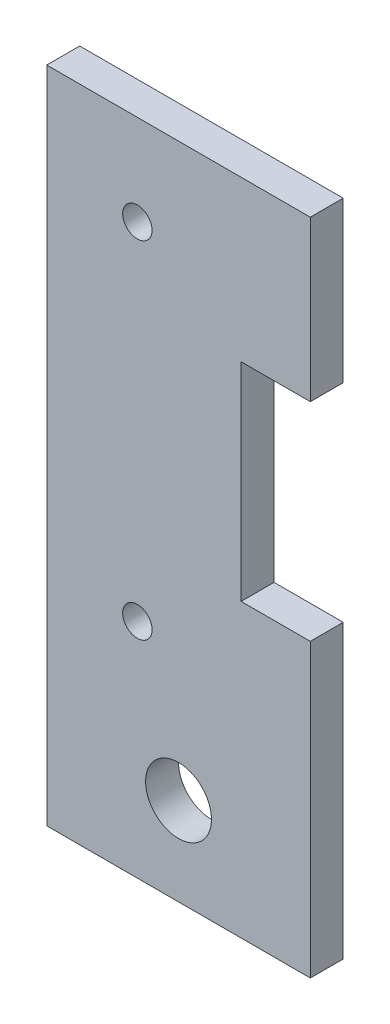
ISO-10303-21;
HEADER;
FILE_DESCRIPTION(('STEP AP214'),'2;1');
FILE_NAME('part.step','',(''),(''),'','','');
FILE_SCHEMA(('AUTOMOTIVE_DESIGN { 1 0 10303 214 1 1 1 1 }'));
ENDSEC;
DATA;
#1=APPLICATION_CONTEXT('core data for automotive mechanical design processes');
#2=APPLICATION_PROTOCOL_DEFINITION('international standard','automotive_design',2000,#1);
#3=PRODUCT_CONTEXT('',#1,'mechanical');
#4=PRODUCT('Part','Part','',(#3));
#5=PRODUCT_RELATED_PRODUCT_CATEGORY('part','',(#4));
#6=PRODUCT_DEFINITION_FORMATION('','',#4);
#7=PRODUCT_DEFINITION_CONTEXT('part definition',#1,'design');
#8=PRODUCT_DEFINITION('design','',#6,#7);
#9=PRODUCT_DEFINITION_SHAPE('','',#8);
#10=(LENGTH_UNIT() NAMED_UNIT(*) SI_UNIT(.MILLI.,.METRE.));
#11=(NAMED_UNIT(*) PLANE_ANGLE_UNIT() SI_UNIT($,.RADIAN.));
#12=(NAMED_UNIT(*) SI_UNIT($,.STERADIAN.) SOLID_ANGLE_UNIT());
#13=UNCERTAINTY_MEASURE_WITH_UNIT(LENGTH_MEASURE(1.E-05),#10,'distance_accuracy_value','');
#14=(GEOMETRIC_REPRESENTATION_CONTEXT(3) GLOBAL_UNCERTAINTY_ASSIGNED_CONTEXT((#13)) GLOBAL_UNIT_ASSIGNED_CONTEXT((#10,
#11,#12)) REPRESENTATION_CONTEXT('',''));
#15=CARTESIAN_POINT('',(0.,0.,0.));
#16=DIRECTION('',(0.,0.,1.));
#17=DIRECTION('',(1.,0.,0.));
#18=AXIS2_PLACEMENT_3D('',#15,#16,#17);
#19=CARTESIAN_POINT('',(0.,38.1,4.7625));
#20=DIRECTION('',(-1.,0.,0.));
#21=DIRECTION('',(0.,-1.,0.));
#22=AXIS2_PLACEMENT_3D('',#19,#20,#21);
#23=PLANE('',#22);
#24=DIRECTION('',(0.,0.,-1.));
#25=VECTOR('',#24,1.);
#26=CARTESIAN_POINT('',(0.,15.,4.7625));
#27=LINE('',#26,#25);
#28=CARTESIAN_POINT('',(0.,15.,4.7625));
#29=VERTEX_POINT('',#28);
#30=CARTESIAN_POINT('',(0.,15.,0.));
#31=VERTEX_POINT('',#30);
#32=EDGE_CURVE('E150',#29,#31,#27,.T.);
#33=ORIENTED_EDGE('',*,*,#32,.T.);
#34=DIRECTION('',(0.,1.,0.));
#35=VECTOR('',#34,1.);
#36=CARTESIAN_POINT('',(0.,38.1,0.));
#37=LINE('',#36,#35);
#38=CARTESIAN_POINT('',(0.,38.1,0.));
#39=VERTEX_POINT('',#38);
#40=EDGE_CURVE('E166',#31,#39,#37,.T.);
#41=ORIENTED_EDGE('',*,*,#40,.T.);
#42=DIRECTION('',(0.,0.,-1.));
#43=VECTOR('',#42,1.);
#44=CARTESIAN_POINT('',(0.,38.1,4.7625));
#45=LINE('',#44,#43);
#46=CARTESIAN_POINT('',(0.,38.1,4.7625));
#47=VERTEX_POINT('',#46);
#48=EDGE_CURVE('E11',#47,#39,#45,.T.);
#49=ORIENTED_EDGE('',*,*,#48,.F.);
#50=DIRECTION('',(0.,1.,0.));
#51=VECTOR('',#50,1.);
#52=CARTESIAN_POINT('',(0.,38.1,4.7625));
#53=LINE('',#52,#51);
#54=EDGE_CURVE('E92',#29,#47,#53,.T.);
#55=ORIENTED_EDGE('',*,*,#54,.F.);
#56=EDGE_LOOP('',(#33,#41,#49,#55));
#57=FACE_BOUND('',#56,.T.);
#58=ADVANCED_FACE('F41',(#57),#23,.F.);
#59=DIRECTION('',(0.,0.,-1.));
#60=VECTOR('',#59,1.);
#61=CARTESIAN_POINT('',(0.,-15.,4.7625));
#62=LINE('',#61,#60);
#63=CARTESIAN_POINT('',(0.,-15.,4.7625));
#64=VERTEX_POINT('',#63);
#65=CARTESIAN_POINT('',(0.,-15.,0.));
#66=VERTEX_POINT('',#65);
#67=EDGE_CURVE('E55',#64,#66,#62,.T.);
#68=ORIENTED_EDGE('',*,*,#67,.F.);
#69=CARTESIAN_POINT('',(0.,-57.15,4.7625));
#70=VERTEX_POINT('',#69);
#71=EDGE_CURVE('E155',#70,#64,#53,.T.);
#72=ORIENTED_EDGE('',*,*,#71,.F.);
#73=DIRECTION('',(0.,0.,-1.));
#74=VECTOR('',#73,1.);
#75=CARTESIAN_POINT('',(0.,-57.15,4.7625));
#76=LINE('',#75,#74);
#77=CARTESIAN_POINT('',(0.,-57.15,0.));
#78=VERTEX_POINT('',#77);
#79=EDGE_CURVE('E162',#70,#78,#76,.T.);
#80=ORIENTED_EDGE('',*,*,#79,.T.);
#81=EDGE_CURVE('E163',#78,#66,#37,.T.);
#82=ORIENTED_EDGE('',*,*,#81,.T.);
#83=EDGE_LOOP('',(#68,#72,#80,#82));
#84=FACE_BOUND('',#83,.T.);
#85=ADVANCED_FACE('F183',(#84),#23,.F.);
#86=CARTESIAN_POINT('',(0.,0.,4.7625));
#87=DIRECTION('',(0.,0.,-1.));
#88=DIRECTION('',(-1.,0.,0.));
#89=AXIS2_PLACEMENT_3D('',#86,#87,#88);
#90=PLANE('',#89);
#91=DIRECTION('',(-1.,0.,0.));
#92=VECTOR('',#91,1.);
#93=CARTESIAN_POINT('',(0.,15.,4.7625));
#94=LINE('',#93,#92);
#95=CARTESIAN_POINT('',(-9.99999999999999,15.,4.7625));
#96=VERTEX_POINT('',#95);
#97=EDGE_CURVE('E132',#29,#96,#94,.T.);
#98=ORIENTED_EDGE('',*,*,#97,.F.);
#99=ORIENTED_EDGE('',*,*,#54,.T.);
#100=DIRECTION('',(-1.,0.,0.));
#101=VECTOR('',#100,1.);
#102=CARTESIAN_POINT('',(0.,38.1,4.7625));
#103=LINE('',#102,#101);
#104=CARTESIAN_POINT('',(-38.1,38.1,4.7625));
#105=VERTEX_POINT('',#104);
#106=EDGE_CURVE('E157',#47,#105,#103,.T.);
#107=ORIENTED_EDGE('',*,*,#106,.T.);
#108=DIRECTION('',(0.,-1.,0.));
#109=VECTOR('',#108,1.);
#110=CARTESIAN_POINT('',(-38.1,38.1,4.7625));
#111=LINE('',#110,#109);
#112=CARTESIAN_POINT('',(-38.1,-57.15,4.7625));
#113=VERTEX_POINT('',#112);
#114=EDGE_CURVE('E159',#105,#113,#111,.T.);
#115=ORIENTED_EDGE('',*,*,#114,.T.);
#116=DIRECTION('',(1.,0.,0.));
#117=VECTOR('',#116,1.);
#118=CARTESIAN_POINT('',(0.,-57.15,4.7625));
#119=LINE('',#118,#117);
#120=EDGE_CURVE('E64',#113,#70,#119,.T.);
#121=ORIENTED_EDGE('',*,*,#120,.T.);
#122=ORIENTED_EDGE('',*,*,#71,.T.);
#123=DIRECTION('',(1.,0.,0.));
#124=VECTOR('',#123,1.);
#125=CARTESIAN_POINT('',(0.,-15.,4.7625));
#126=LINE('',#125,#124);
#127=CARTESIAN_POINT('',(-9.99999999999999,-15.,4.7625));
#128=VERTEX_POINT('',#127);
#129=EDGE_CURVE('E143',#128,#64,#126,.T.);
#130=ORIENTED_EDGE('',*,*,#129,.F.);
#131=DIRECTION('',(0.,-1.,0.));
#132=VECTOR('',#131,1.);
#133=CARTESIAN_POINT('',(-9.99999999999999,15.,4.7625));
#134=LINE('',#133,#132);
#135=EDGE_CURVE('E123',#96,#128,#134,.T.);
#136=ORIENTED_EDGE('',*,*,#135,.F.);
#137=EDGE_LOOP('',(#98,#99,#107,#115,#121,#122,#130,#136));
#138=FACE_BOUND('',#137,.T.);
#139=CARTESIAN_POINT('',(-25.,25.,4.7625));
#140=DIRECTION('',(0.,0.,1.));
#141=DIRECTION('',(1.,0.,0.));
#142=AXIS2_PLACEMENT_3D('',#139,#140,#141);
#143=CIRCLE('',#142,2.125);
#144=CARTESIAN_POINT('',(-27.125,25.,4.7625));
#145=VERTEX_POINT('',#144);
#146=EDGE_CURVE('E151',#145,#145,#143,.T.);
#147=ORIENTED_EDGE('',*,*,#146,.F.);
#148=EDGE_LOOP('',(#147));
#149=FACE_BOUND('',#148,.T.);
#150=CARTESIAN_POINT('',(-25.,-25.,4.7625));
#151=DIRECTION('',(0.,0.,1.));
#152=DIRECTION('',(1.,0.,0.));
#153=AXIS2_PLACEMENT_3D('',#150,#151,#152);
#154=CIRCLE('',#153,2.125);
#155=CARTESIAN_POINT('',(-27.125,-25.,4.7625));
#156=VERTEX_POINT('',#155);
#157=EDGE_CURVE('E217',#156,#156,#154,.T.);
#158=ORIENTED_EDGE('',*,*,#157,.F.);
#159=EDGE_LOOP('',(#158));
#160=FACE_BOUND('',#159,.T.);
#161=CARTESIAN_POINT('',(-19.05,-44.45,4.7625));
#162=DIRECTION('',(0.,0.,1.));
#163=DIRECTION('',(1.,0.,0.));
#164=AXIS2_PLACEMENT_3D('',#161,#162,#163);
#165=CIRCLE('',#164,4.7625);
#166=CARTESIAN_POINT('',(-23.8125,-44.45,4.7625));
#167=VERTEX_POINT('',#166);
#168=EDGE_CURVE('E207',#167,#167,#165,.T.);
#169=ORIENTED_EDGE('',*,*,#168,.F.);
#170=EDGE_LOOP('',(#169));
#171=FACE_BOUND('',#170,.T.);
#172=ADVANCED_FACE('F203',(#138,#149,#160,#171),#90,.F.);
#173=CARTESIAN_POINT('',(0.,0.,0.));
#174=DIRECTION('',(0.,0.,-1.));
#175=DIRECTION('',(-1.,0.,0.));
#176=AXIS2_PLACEMENT_3D('',#173,#174,#175);
#177=PLANE('',#176);
#178=CARTESIAN_POINT('',(-25.,-25.,0.));
#179=DIRECTION('',(0.,0.,1.));
#180=DIRECTION('',(1.,0.,0.));
#181=AXIS2_PLACEMENT_3D('',#178,#179,#180);
#182=CIRCLE('',#181,2.125);
#183=CARTESIAN_POINT('',(-27.125,-25.,0.));
#184=VERTEX_POINT('',#183);
#185=EDGE_CURVE('E154',#184,#184,#182,.T.);
#186=ORIENTED_EDGE('',*,*,#185,.T.);
#187=EDGE_LOOP('',(#186));
#188=FACE_BOUND('',#187,.T.);
#189=ORIENTED_EDGE('',*,*,#40,.F.);
#190=DIRECTION('',(-1.,0.,0.));
#191=VECTOR('',#190,1.);
#192=CARTESIAN_POINT('',(0.,15.,0.));
#193=LINE('',#192,#191);
#194=CARTESIAN_POINT('',(-9.99999999999999,15.,0.));
#195=VERTEX_POINT('',#194);
#196=EDGE_CURVE('E137',#31,#195,#193,.T.);
#197=ORIENTED_EDGE('',*,*,#196,.T.);
#198=DIRECTION('',(0.,-1.,0.));
#199=VECTOR('',#198,1.);
#200=CARTESIAN_POINT('',(-9.99999999999999,15.,0.));
#201=LINE('',#200,#199);
#202=CARTESIAN_POINT('',(-9.99999999999999,-15.,0.));
#203=VERTEX_POINT('',#202);
#204=EDGE_CURVE('E120',#195,#203,#201,.T.);
#205=ORIENTED_EDGE('',*,*,#204,.T.);
#206=DIRECTION('',(1.,0.,0.));
#207=VECTOR('',#206,1.);
#208=CARTESIAN_POINT('',(0.,-15.,0.));
#209=LINE('',#208,#207);
#210=EDGE_CURVE('E127',#203,#66,#209,.T.);
#211=ORIENTED_EDGE('',*,*,#210,.T.);
#212=ORIENTED_EDGE('',*,*,#81,.F.);
#213=DIRECTION('',(1.,0.,0.));
#214=VECTOR('',#213,1.);
#215=CARTESIAN_POINT('',(0.,-57.15,0.));
#216=LINE('',#215,#214);
#217=CARTESIAN_POINT('',(-38.1,-57.15,0.));
#218=VERTEX_POINT('',#217);
#219=EDGE_CURVE('E85',#218,#78,#216,.T.);
#220=ORIENTED_EDGE('',*,*,#219,.F.);
#221=DIRECTION('',(0.,-1.,0.));
#222=VECTOR('',#221,1.);
#223=CARTESIAN_POINT('',(-38.1,38.1,0.));
#224=LINE('',#223,#222);
#225=CARTESIAN_POINT('',(-38.1,38.1,0.));
#226=VERTEX_POINT('',#225);
#227=EDGE_CURVE('E168',#226,#218,#224,.T.);
#228=ORIENTED_EDGE('',*,*,#227,.F.);
#229=DIRECTION('',(-1.,0.,0.));
#230=VECTOR('',#229,1.);
#231=CARTESIAN_POINT('',(0.,38.1,0.));
#232=LINE('',#231,#230);
#233=EDGE_CURVE('E165',#39,#226,#232,.T.);
#234=ORIENTED_EDGE('',*,*,#233,.F.);
#235=EDGE_LOOP('',(#189,#197,#205,#211,#212,#220,#228,#234));
#236=FACE_BOUND('',#235,.T.);
#237=CARTESIAN_POINT('',(-25.,25.,0.));
#238=DIRECTION('',(0.,0.,1.));
#239=DIRECTION('',(1.,0.,0.));
#240=AXIS2_PLACEMENT_3D('',#237,#238,#239);
#241=CIRCLE('',#240,2.125);
#242=CARTESIAN_POINT('',(-27.125,25.,0.));
#243=VERTEX_POINT('',#242);
#244=EDGE_CURVE('E147',#243,#243,#241,.T.);
#245=ORIENTED_EDGE('',*,*,#244,.T.);
#246=EDGE_LOOP('',(#245));
#247=FACE_BOUND('',#246,.T.);
#248=CARTESIAN_POINT('',(-19.05,-44.45,0.));
#249=DIRECTION('',(0.,0.,1.));
#250=DIRECTION('',(1.,0.,0.));
#251=AXIS2_PLACEMENT_3D('',#248,#249,#250);
#252=CIRCLE('',#251,4.7625);
#253=CARTESIAN_POINT('',(-23.8125,-44.45,0.));
#254=VERTEX_POINT('',#253);
#255=EDGE_CURVE('E139',#254,#254,#252,.T.);
#256=ORIENTED_EDGE('',*,*,#255,.T.);
#257=EDGE_LOOP('',(#256));
#258=FACE_BOUND('',#257,.T.);
#259=ADVANCED_FACE('F135',(#188,#236,#247,#258),#177,.T.);
#260=CARTESIAN_POINT('',(0.,38.1,4.7625));
#261=DIRECTION('',(0.,-1.,0.));
#262=DIRECTION('',(1.,0.,0.));
#263=AXIS2_PLACEMENT_3D('',#260,#261,#262);
#264=PLANE('',#263);
#265=ORIENTED_EDGE('',*,*,#233,.T.);
#266=DIRECTION('',(0.,0.,-1.));
#267=VECTOR('',#266,1.);
#268=CARTESIAN_POINT('',(-38.1,38.1,4.7625));
#269=LINE('',#268,#267);
#270=EDGE_CURVE('E48',#105,#226,#269,.T.);
#271=ORIENTED_EDGE('',*,*,#270,.F.);
#272=ORIENTED_EDGE('',*,*,#106,.F.);
#273=ORIENTED_EDGE('',*,*,#48,.T.);
#274=EDGE_LOOP('',(#265,#271,#272,#273));
#275=FACE_BOUND('',#274,.T.);
#276=ADVANCED_FACE('F195',(#275),#264,.F.);
#277=CARTESIAN_POINT('',(-38.1,38.1,4.7625));
#278=DIRECTION('',(1.,0.,0.));
#279=DIRECTION('',(0.,1.,0.));
#280=AXIS2_PLACEMENT_3D('',#277,#278,#279);
#281=PLANE('',#280);
#282=ORIENTED_EDGE('',*,*,#227,.T.);
#283=DIRECTION('',(0.,0.,-1.));
#284=VECTOR('',#283,1.);
#285=CARTESIAN_POINT('',(-38.1,-57.15,4.7625));
#286=LINE('',#285,#284);
#287=EDGE_CURVE('E172',#113,#218,#286,.T.);
#288=ORIENTED_EDGE('',*,*,#287,.F.);
#289=ORIENTED_EDGE('',*,*,#114,.F.);
#290=ORIENTED_EDGE('',*,*,#270,.T.);
#291=EDGE_LOOP('',(#282,#288,#289,#290));
#292=FACE_BOUND('',#291,.T.);
#293=ADVANCED_FACE('F178',(#292),#281,.F.);
#294=CARTESIAN_POINT('',(0.,-57.15,4.7625));
#295=DIRECTION('',(0.,1.,0.));
#296=DIRECTION('',(-1.,0.,0.));
#297=AXIS2_PLACEMENT_3D('',#294,#295,#296);
#298=PLANE('',#297);
#299=ORIENTED_EDGE('',*,*,#219,.T.);
#300=ORIENTED_EDGE('',*,*,#79,.F.);
#301=ORIENTED_EDGE('',*,*,#120,.F.);
#302=ORIENTED_EDGE('',*,*,#287,.T.);
#303=EDGE_LOOP('',(#299,#300,#301,#302));
#304=FACE_BOUND('',#303,.T.);
#305=ADVANCED_FACE('F185',(#304),#298,.F.);
#306=CARTESIAN_POINT('',(0.,15.,4.7625));
#307=DIRECTION('',(0.,-1.,0.));
#308=DIRECTION('',(1.,0.,0.));
#309=AXIS2_PLACEMENT_3D('',#306,#307,#308);
#310=PLANE('',#309);
#311=ORIENTED_EDGE('',*,*,#196,.F.);
#312=ORIENTED_EDGE('',*,*,#32,.F.);
#313=ORIENTED_EDGE('',*,*,#97,.T.);
#314=DIRECTION('',(0.,0.,-1.));
#315=VECTOR('',#314,1.);
#316=CARTESIAN_POINT('',(-9.99999999999999,15.,4.7625));
#317=LINE('',#316,#315);
#318=EDGE_CURVE('E125',#96,#195,#317,.T.);
#319=ORIENTED_EDGE('',*,*,#318,.T.);
#320=EDGE_LOOP('',(#311,#312,#313,#319));
#321=FACE_BOUND('',#320,.T.);
#322=ADVANCED_FACE('F187',(#321),#310,.T.);
#323=CARTESIAN_POINT('',(-9.99999999999999,15.,4.7625));
#324=DIRECTION('',(1.,0.,0.));
#325=DIRECTION('',(0.,0.,-1.));
#326=AXIS2_PLACEMENT_3D('',#323,#324,#325);
#327=PLANE('',#326);
#328=ORIENTED_EDGE('',*,*,#204,.F.);
#329=ORIENTED_EDGE('',*,*,#318,.F.);
#330=ORIENTED_EDGE('',*,*,#135,.T.);
#331=DIRECTION('',(0.,0.,-1.));
#332=VECTOR('',#331,1.);
#333=CARTESIAN_POINT('',(-9.99999999999999,-15.,4.7625));
#334=LINE('',#333,#332);
#335=EDGE_CURVE('E116',#128,#203,#334,.T.);
#336=ORIENTED_EDGE('',*,*,#335,.T.);
#337=EDGE_LOOP('',(#328,#329,#330,#336));
#338=FACE_BOUND('',#337,.T.);
#339=ADVANCED_FACE('F117',(#338),#327,.T.);
#340=CARTESIAN_POINT('',(0.,-15.,4.7625));
#341=DIRECTION('',(0.,1.,0.));
#342=DIRECTION('',(-1.,0.,0.));
#343=AXIS2_PLACEMENT_3D('',#340,#341,#342);
#344=PLANE('',#343);
#345=ORIENTED_EDGE('',*,*,#210,.F.);
#346=ORIENTED_EDGE('',*,*,#335,.F.);
#347=ORIENTED_EDGE('',*,*,#129,.T.);
#348=ORIENTED_EDGE('',*,*,#67,.T.);
#349=EDGE_LOOP('',(#345,#346,#347,#348));
#350=FACE_BOUND('',#349,.T.);
#351=ADVANCED_FACE('F128',(#350),#344,.T.);
#352=CARTESIAN_POINT('',(-25.,25.,4.7625));
#353=DIRECTION('',(0.,0.,-1.));
#354=DIRECTION('',(-1.,0.,0.));
#355=AXIS2_PLACEMENT_3D('',#352,#353,#354);
#356=CYLINDRICAL_SURFACE('',#355,2.125);
#357=CARTESIAN_POINT('',(-27.125,25.,4.7625));
#358=CARTESIAN_POINT('',(-27.125,25.,4.712890625));
#359=CARTESIAN_POINT('',(-27.125,25.,4.66328125));
#360=CARTESIAN_POINT('',(-27.125,25.,4.5640625));
#361=CARTESIAN_POINT('',(-27.125,25.,4.514453125));
#362=CARTESIAN_POINT('',(-27.125,25.,4.415234375));
#363=CARTESIAN_POINT('',(-27.125,25.,4.365625));
#364=CARTESIAN_POINT('',(-27.125,25.,4.26640625));
#365=CARTESIAN_POINT('',(-27.125,25.,4.216796875));
#366=CARTESIAN_POINT('',(-27.125,25.,4.117578125));
#367=CARTESIAN_POINT('',(-27.125,25.,4.06796875));
#368=CARTESIAN_POINT('',(-27.125,25.,3.96875));
#369=CARTESIAN_POINT('',(-27.125,25.,3.919140625));
#370=CARTESIAN_POINT('',(-27.125,25.,3.819921875));
#371=CARTESIAN_POINT('',(-27.125,25.,3.7703125));
#372=CARTESIAN_POINT('',(-27.125,25.,3.67109375));
#373=CARTESIAN_POINT('',(-27.125,25.,3.621484375));
#374=CARTESIAN_POINT('',(-27.125,25.,3.522265625));
#375=CARTESIAN_POINT('',(-27.125,25.,3.47265625));
#376=CARTESIAN_POINT('',(-27.125,25.,3.3734375));
#377=CARTESIAN_POINT('',(-27.125,25.,3.323828125));
#378=CARTESIAN_POINT('',(-27.125,25.,3.224609375));
#379=CARTESIAN_POINT('',(-27.125,25.,3.175));
#380=CARTESIAN_POINT('',(-27.125,25.,3.07578125));
#381=CARTESIAN_POINT('',(-27.125,25.,3.026171875));
#382=CARTESIAN_POINT('',(-27.125,25.,2.926953125));
#383=CARTESIAN_POINT('',(-27.125,25.,2.87734375));
#384=CARTESIAN_POINT('',(-27.125,25.,2.778125));
#385=CARTESIAN_POINT('',(-27.125,25.,2.728515625));
#386=CARTESIAN_POINT('',(-27.125,25.,2.629296875));
#387=CARTESIAN_POINT('',(-27.125,25.,2.5796875));
#388=CARTESIAN_POINT('',(-27.125,25.,2.48046875));
#389=CARTESIAN_POINT('',(-27.125,25.,2.430859375));
#390=CARTESIAN_POINT('',(-27.125,25.,2.331640625));
#391=CARTESIAN_POINT('',(-27.125,25.,2.28203125));
#392=CARTESIAN_POINT('',(-27.125,25.,2.1828125));
#393=CARTESIAN_POINT('',(-27.125,25.,2.133203125));
#394=CARTESIAN_POINT('',(-27.125,25.,2.033984375));
#395=CARTESIAN_POINT('',(-27.125,25.,1.984375));
#396=CARTESIAN_POINT('',(-27.125,25.,1.88515625));
#397=CARTESIAN_POINT('',(-27.125,25.,1.835546875));
#398=CARTESIAN_POINT('',(-27.125,25.,1.736328125));
#399=CARTESIAN_POINT('',(-27.125,25.,1.68671875));
#400=CARTESIAN_POINT('',(-27.125,25.,1.5875));
#401=CARTESIAN_POINT('',(-27.125,25.,1.537890625));
#402=CARTESIAN_POINT('',(-27.125,25.,1.438671875));
#403=CARTESIAN_POINT('',(-27.125,25.,1.3890625));
#404=CARTESIAN_POINT('',(-27.125,25.,1.28984375));
#405=CARTESIAN_POINT('',(-27.125,25.,1.240234375));
#406=CARTESIAN_POINT('',(-27.125,25.,1.141015625));
#407=CARTESIAN_POINT('',(-27.125,25.,1.09140625));
#408=CARTESIAN_POINT('',(-27.125,25.,0.9921875));
#409=CARTESIAN_POINT('',(-27.125,25.,0.942578125));
#410=CARTESIAN_POINT('',(-27.125,25.,0.843359375));
#411=CARTESIAN_POINT('',(-27.125,25.,0.79375));
#412=CARTESIAN_POINT('',(-27.125,25.,0.69453125));
#413=CARTESIAN_POINT('',(-27.125,25.,0.644921875));
#414=CARTESIAN_POINT('',(-27.125,25.,0.545703125));
#415=CARTESIAN_POINT('',(-27.125,25.,0.49609375));
#416=CARTESIAN_POINT('',(-27.125,25.,0.396875));
#417=CARTESIAN_POINT('',(-27.125,25.,0.347265625));
#418=CARTESIAN_POINT('',(-27.125,25.,0.248046875));
#419=CARTESIAN_POINT('',(-27.125,25.,0.1984375));
#420=CARTESIAN_POINT('',(-27.125,25.,0.09921875));
#421=CARTESIAN_POINT('',(-27.125,25.,0.049609375));
#422=CARTESIAN_POINT('',(-27.125,25.,0.));
#423=B_SPLINE_CURVE_WITH_KNOTS('',3,(#357,#358,#359,#360,#361,#362,#363,#364,#365,#366,#367,
#368,#369,#370,#371,#372,#373,#374,#375,#376,#377,#378,#379,#380,#381,#382,#383,#384,#385,#386,
#387,#388,#389,#390,#391,#392,#393,#394,#395,#396,#397,#398,#399,#400,#401,#402,#403,#404,#405,
#406,#407,#408,#409,#410,#411,#412,#413,#414,#415,#416,#417,#418,#419,#420,#421,#422),
.UNSPECIFIED.,.F.,.F.,(4,2,2,2,2,2,2,2,2,2,2,2,2,2,2,2,2,2,2,2,2,2,2,2,2,2,2,2,2,2,2,2,4),(0.,
0.148828124999999,0.297656249999999,0.446484374999999,0.595312499999999,0.744140625,0.89296875,
1.041796875,1.190625,1.339453125,1.48828125,1.637109375,1.7859375,1.934765625,2.08359375,
2.232421875,2.38125,2.530078125,2.67890625,2.827734375,2.9765625,3.125390625,3.27421875,
3.423046875,3.571875,3.720703125,3.86953125,4.018359375,4.1671875,4.316015625,4.46484375,
4.613671875,4.7625),.UNSPECIFIED.);
#424=EDGE_CURVE('BSEAM232',#145,#243,#423,.T.);
#425=ORIENTED_EDGE('',*,*,#146,.T.);
#426=ORIENTED_EDGE('',*,*,#244,.F.);
#427=ORIENTED_EDGE('',*,*,#424,.T.);
#428=ORIENTED_EDGE('',*,*,#424,.F.);
#429=EDGE_LOOP('',(#425,#427,#426,#428));
#430=FACE_BOUND('',#429,.T.);
#431=ADVANCED_FACE('F232',(#430),#356,.F.);
#432=CARTESIAN_POINT('',(-25.,-25.,4.7625));
#433=DIRECTION('',(0.,0.,-1.));
#434=DIRECTION('',(-1.,0.,0.));
#435=AXIS2_PLACEMENT_3D('',#432,#433,#434);
#436=CYLINDRICAL_SURFACE('',#435,2.125);
#437=CARTESIAN_POINT('',(-27.125,-25.,4.7625));
#438=CARTESIAN_POINT('',(-27.125,-25.,4.712890625));
#439=CARTESIAN_POINT('',(-27.125,-25.,4.66328125));
#440=CARTESIAN_POINT('',(-27.125,-25.,4.5640625));
#441=CARTESIAN_POINT('',(-27.125,-25.,4.514453125));
#442=CARTESIAN_POINT('',(-27.125,-25.,4.415234375));
#443=CARTESIAN_POINT('',(-27.125,-25.,4.365625));
#444=CARTESIAN_POINT('',(-27.125,-25.,4.26640625));
#445=CARTESIAN_POINT('',(-27.125,-25.,4.216796875));
#446=CARTESIAN_POINT('',(-27.125,-25.,4.117578125));
#447=CARTESIAN_POINT('',(-27.125,-25.,4.06796875));
#448=CARTESIAN_POINT('',(-27.125,-25.,3.96875));
#449=CARTESIAN_POINT('',(-27.125,-25.,3.919140625));
#450=CARTESIAN_POINT('',(-27.125,-25.,3.819921875));
#451=CARTESIAN_POINT('',(-27.125,-25.,3.7703125));
#452=CARTESIAN_POINT('',(-27.125,-25.,3.67109375));
#453=CARTESIAN_POINT('',(-27.125,-25.,3.621484375));
#454=CARTESIAN_POINT('',(-27.125,-25.,3.522265625));
#455=CARTESIAN_POINT('',(-27.125,-25.,3.47265625));
#456=CARTESIAN_POINT('',(-27.125,-25.,3.3734375));
#457=CARTESIAN_POINT('',(-27.125,-25.,3.323828125));
#458=CARTESIAN_POINT('',(-27.125,-25.,3.224609375));
#459=CARTESIAN_POINT('',(-27.125,-25.,3.175));
#460=CARTESIAN_POINT('',(-27.125,-25.,3.07578125));
#461=CARTESIAN_POINT('',(-27.125,-25.,3.026171875));
#462=CARTESIAN_POINT('',(-27.125,-25.,2.926953125));
#463=CARTESIAN_POINT('',(-27.125,-25.,2.87734375));
#464=CARTESIAN_POINT('',(-27.125,-25.,2.778125));
#465=CARTESIAN_POINT('',(-27.125,-25.,2.728515625));
#466=CARTESIAN_POINT('',(-27.125,-25.,2.629296875));
#467=CARTESIAN_POINT('',(-27.125,-25.,2.5796875));
#468=CARTESIAN_POINT('',(-27.125,-25.,2.48046875));
#469=CARTESIAN_POINT('',(-27.125,-25.,2.430859375));
#470=CARTESIAN_POINT('',(-27.125,-25.,2.331640625));
#471=CARTESIAN_POINT('',(-27.125,-25.,2.28203125));
#472=CARTESIAN_POINT('',(-27.125,-25.,2.1828125));
#473=CARTESIAN_POINT('',(-27.125,-25.,2.133203125));
#474=CARTESIAN_POINT('',(-27.125,-25.,2.033984375));
#475=CARTESIAN_POINT('',(-27.125,-25.,1.984375));
#476=CARTESIAN_POINT('',(-27.125,-25.,1.88515625));
#477=CARTESIAN_POINT('',(-27.125,-25.,1.835546875));
#478=CARTESIAN_POINT('',(-27.125,-25.,1.736328125));
#479=CARTESIAN_POINT('',(-27.125,-25.,1.68671875));
#480=CARTESIAN_POINT('',(-27.125,-25.,1.5875));
#481=CARTESIAN_POINT('',(-27.125,-25.,1.537890625));
#482=CARTESIAN_POINT('',(-27.125,-25.,1.438671875));
#483=CARTESIAN_POINT('',(-27.125,-25.,1.3890625));
#484=CARTESIAN_POINT('',(-27.125,-25.,1.28984375));
#485=CARTESIAN_POINT('',(-27.125,-25.,1.240234375));
#486=CARTESIAN_POINT('',(-27.125,-25.,1.141015625));
#487=CARTESIAN_POINT('',(-27.125,-25.,1.09140625));
#488=CARTESIAN_POINT('',(-27.125,-25.,0.9921875));
#489=CARTESIAN_POINT('',(-27.125,-25.,0.942578125));
#490=CARTESIAN_POINT('',(-27.125,-25.,0.843359375));
#491=CARTESIAN_POINT('',(-27.125,-25.,0.79375));
#492=CARTESIAN_POINT('',(-27.125,-25.,0.69453125));
#493=CARTESIAN_POINT('',(-27.125,-25.,0.644921875));
#494=CARTESIAN_POINT('',(-27.125,-25.,0.545703125));
#495=CARTESIAN_POINT('',(-27.125,-25.,0.49609375));
#496=CARTESIAN_POINT('',(-27.125,-25.,0.396875));
#497=CARTESIAN_POINT('',(-27.125,-25.,0.347265625));
#498=CARTESIAN_POINT('',(-27.125,-25.,0.248046875));
#499=CARTESIAN_POINT('',(-27.125,-25.,0.1984375));
#500=CARTESIAN_POINT('',(-27.125,-25.,0.09921875));
#501=CARTESIAN_POINT('',(-27.125,-25.,0.049609375));
#502=CARTESIAN_POINT('',(-27.125,-25.,0.));
#503=B_SPLINE_CURVE_WITH_KNOTS('',3,(#437,#438,#439,#440,#441,#442,#443,#444,#445,#446,#447,
#448,#449,#450,#451,#452,#453,#454,#455,#456,#457,#458,#459,#460,#461,#462,#463,#464,#465,#466,
#467,#468,#469,#470,#471,#472,#473,#474,#475,#476,#477,#478,#479,#480,#481,#482,#483,#484,#485,
#486,#487,#488,#489,#490,#491,#492,#493,#494,#495,#496,#497,#498,#499,#500,#501,#502),
.UNSPECIFIED.,.F.,.F.,(4,2,2,2,2,2,2,2,2,2,2,2,2,2,2,2,2,2,2,2,2,2,2,2,2,2,2,2,2,2,2,2,4),(0.,
0.148828124999999,0.297656249999999,0.446484374999999,0.595312499999999,0.744140625,0.89296875,
1.041796875,1.190625,1.339453125,1.48828125,1.637109375,1.7859375,1.934765625,2.08359375,
2.232421875,2.38125,2.530078125,2.67890625,2.827734375,2.9765625,3.125390625,3.27421875,
3.423046875,3.571875,3.720703125,3.86953125,4.018359375,4.1671875,4.316015625,4.46484375,
4.613671875,4.7625),.UNSPECIFIED.);
#504=EDGE_CURVE('BSEAM228',#156,#184,#503,.T.);
#505=ORIENTED_EDGE('',*,*,#157,.T.);
#506=ORIENTED_EDGE('',*,*,#185,.F.);
#507=ORIENTED_EDGE('',*,*,#504,.T.);
#508=ORIENTED_EDGE('',*,*,#504,.F.);
#509=EDGE_LOOP('',(#505,#507,#506,#508));
#510=FACE_BOUND('',#509,.T.);
#511=ADVANCED_FACE('F228',(#510),#436,.F.);
#512=CARTESIAN_POINT('',(-19.05,-44.45,4.7625));
#513=DIRECTION('',(0.,0.,-1.));
#514=DIRECTION('',(-1.,0.,0.));
#515=AXIS2_PLACEMENT_3D('',#512,#513,#514);
#516=CYLINDRICAL_SURFACE('',#515,4.7625);
#517=CARTESIAN_POINT('',(-23.8125,-44.45,4.7625));
#518=CARTESIAN_POINT('',(-23.8125,-44.45,4.712890625));
#519=CARTESIAN_POINT('',(-23.8125,-44.45,4.66328125));
#520=CARTESIAN_POINT('',(-23.8125,-44.45,4.5640625));
#521=CARTESIAN_POINT('',(-23.8125,-44.45,4.514453125));
#522=CARTESIAN_POINT('',(-23.8125,-44.45,4.415234375));
#523=CARTESIAN_POINT('',(-23.8125,-44.45,4.365625));
#524=CARTESIAN_POINT('',(-23.8125,-44.45,4.26640625));
#525=CARTESIAN_POINT('',(-23.8125,-44.45,4.216796875));
#526=CARTESIAN_POINT('',(-23.8125,-44.45,4.117578125));
#527=CARTESIAN_POINT('',(-23.8125,-44.45,4.06796875));
#528=CARTESIAN_POINT('',(-23.8125,-44.45,3.96875));
#529=CARTESIAN_POINT('',(-23.8125,-44.45,3.919140625));
#530=CARTESIAN_POINT('',(-23.8125,-44.45,3.819921875));
#531=CARTESIAN_POINT('',(-23.8125,-44.45,3.7703125));
#532=CARTESIAN_POINT('',(-23.8125,-44.45,3.67109375));
#533=CARTESIAN_POINT('',(-23.8125,-44.45,3.621484375));
#534=CARTESIAN_POINT('',(-23.8125,-44.45,3.522265625));
#535=CARTESIAN_POINT('',(-23.8125,-44.45,3.47265625));
#536=CARTESIAN_POINT('',(-23.8125,-44.45,3.3734375));
#537=CARTESIAN_POINT('',(-23.8125,-44.45,3.323828125));
#538=CARTESIAN_POINT('',(-23.8125,-44.45,3.224609375));
#539=CARTESIAN_POINT('',(-23.8125,-44.45,3.175));
#540=CARTESIAN_POINT('',(-23.8125,-44.45,3.07578125));
#541=CARTESIAN_POINT('',(-23.8125,-44.45,3.026171875));
#542=CARTESIAN_POINT('',(-23.8125,-44.45,2.926953125));
#543=CARTESIAN_POINT('',(-23.8125,-44.45,2.87734375));
#544=CARTESIAN_POINT('',(-23.8125,-44.45,2.778125));
#545=CARTESIAN_POINT('',(-23.8125,-44.45,2.728515625));
#546=CARTESIAN_POINT('',(-23.8125,-44.45,2.629296875));
#547=CARTESIAN_POINT('',(-23.8125,-44.45,2.5796875));
#548=CARTESIAN_POINT('',(-23.8125,-44.45,2.48046875));
#549=CARTESIAN_POINT('',(-23.8125,-44.45,2.430859375));
#550=CARTESIAN_POINT('',(-23.8125,-44.45,2.331640625));
#551=CARTESIAN_POINT('',(-23.8125,-44.45,2.28203125));
#552=CARTESIAN_POINT('',(-23.8125,-44.45,2.1828125));
#553=CARTESIAN_POINT('',(-23.8125,-44.45,2.133203125));
#554=CARTESIAN_POINT('',(-23.8125,-44.45,2.033984375));
#555=CARTESIAN_POINT('',(-23.8125,-44.45,1.984375));
#556=CARTESIAN_POINT('',(-23.8125,-44.45,1.88515625));
#557=CARTESIAN_POINT('',(-23.8125,-44.45,1.835546875));
#558=CARTESIAN_POINT('',(-23.8125,-44.45,1.736328125));
#559=CARTESIAN_POINT('',(-23.8125,-44.45,1.68671875));
#560=CARTESIAN_POINT('',(-23.8125,-44.45,1.5875));
#561=CARTESIAN_POINT('',(-23.8125,-44.45,1.537890625));
#562=CARTESIAN_POINT('',(-23.8125,-44.45,1.438671875));
#563=CARTESIAN_POINT('',(-23.8125,-44.45,1.3890625));
#564=CARTESIAN_POINT('',(-23.8125,-44.45,1.28984375));
#565=CARTESIAN_POINT('',(-23.8125,-44.45,1.240234375));
#566=CARTESIAN_POINT('',(-23.8125,-44.45,1.141015625));
#567=CARTESIAN_POINT('',(-23.8125,-44.45,1.09140625));
#568=CARTESIAN_POINT('',(-23.8125,-44.45,0.992187499999999));
#569=CARTESIAN_POINT('',(-23.8125,-44.45,0.942578124999999));
#570=CARTESIAN_POINT('',(-23.8125,-44.45,0.843359375));
#571=CARTESIAN_POINT('',(-23.8125,-44.45,0.79375));
#572=CARTESIAN_POINT('',(-23.8125,-44.45,0.69453125));
#573=CARTESIAN_POINT('',(-23.8125,-44.45,0.644921875));
#574=CARTESIAN_POINT('',(-23.8125,-44.45,0.545703125));
#575=CARTESIAN_POINT('',(-23.8125,-44.45,0.49609375));
#576=CARTESIAN_POINT('',(-23.8125,-44.45,0.396875));
#577=CARTESIAN_POINT('',(-23.8125,-44.45,0.347265625));
#578=CARTESIAN_POINT('',(-23.8125,-44.45,0.248046875));
#579=CARTESIAN_POINT('',(-23.8125,-44.45,0.1984375));
#580=CARTESIAN_POINT('',(-23.8125,-44.45,0.09921875));
#581=CARTESIAN_POINT('',(-23.8125,-44.45,0.049609375));
#582=CARTESIAN_POINT('',(-23.8125,-44.45,0.));
#583=B_SPLINE_CURVE_WITH_KNOTS('',3,(#517,#518,#519,#520,#521,#522,#523,#524,#525,#526,#527,
#528,#529,#530,#531,#532,#533,#534,#535,#536,#537,#538,#539,#540,#541,#542,#543,#544,#545,#546,
#547,#548,#549,#550,#551,#552,#553,#554,#555,#556,#557,#558,#559,#560,#561,#562,#563,#564,#565,
#566,#567,#568,#569,#570,#571,#572,#573,#574,#575,#576,#577,#578,#579,#580,#581,#582),
.UNSPECIFIED.,.F.,.F.,(4,2,2,2,2,2,2,2,2,2,2,2,2,2,2,2,2,2,2,2,2,2,2,2,2,2,2,2,2,2,2,2,4),(0.,
0.148828125,0.29765625,0.446484375,0.5953125,0.744140625,0.892968750000001,1.041796875,1.190625,
1.339453125,1.48828125,1.637109375,1.7859375,1.934765625,2.08359375,2.232421875,2.38125,
2.530078125,2.67890625,2.827734375,2.9765625,3.125390625,3.27421875,3.423046875,3.571875,
3.720703125,3.86953125,4.018359375,4.1671875,4.316015625,4.46484375,4.613671875,4.7625),.UNSPECIFIED.);
#584=EDGE_CURVE('BSEAM231',#167,#254,#583,.T.);
#585=ORIENTED_EDGE('',*,*,#168,.T.);
#586=ORIENTED_EDGE('',*,*,#255,.F.);
#587=ORIENTED_EDGE('',*,*,#584,.T.);
#588=ORIENTED_EDGE('',*,*,#584,.F.);
#589=EDGE_LOOP('',(#585,#587,#586,#588));
#590=FACE_BOUND('',#589,.T.);
#591=ADVANCED_FACE('F231',(#590),#516,.F.);
#592=CLOSED_SHELL('',(#58,#85,#172,#259,#276,#293,#305,#322,#339,#351,#431,#511,#591));
#593=MANIFOLD_SOLID_BREP('B2',#592);
#594=ADVANCED_BREP_SHAPE_REPRESENTATION('',(#18,#593),#14);
#595=SHAPE_DEFINITION_REPRESENTATION(#9,#594);
ENDSEC;
END-ISO-10303-21;
